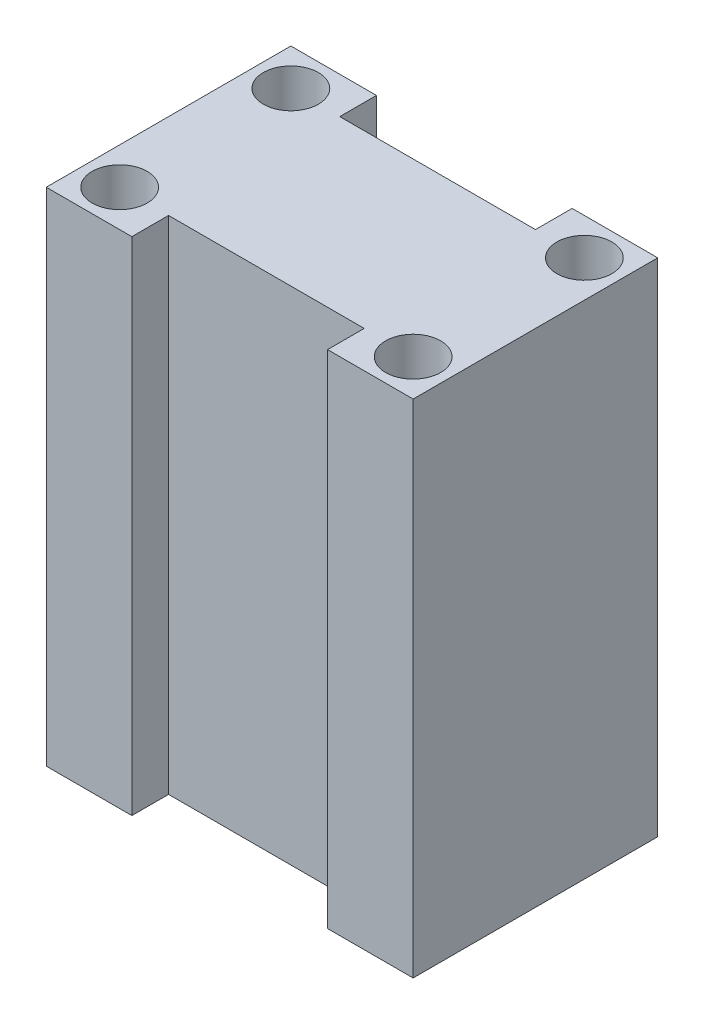
ISO-10303-21;
HEADER;
FILE_DESCRIPTION(('STEP AP214'),'2;1');
FILE_NAME('part.step','',(''),(''),'','','');
FILE_SCHEMA(('AUTOMOTIVE_DESIGN { 1 0 10303 214 1 1 1 1 }'));
ENDSEC;
DATA;
#1=APPLICATION_CONTEXT('core data for automotive mechanical design processes');
#2=APPLICATION_PROTOCOL_DEFINITION('international standard','automotive_design',2000,#1);
#3=PRODUCT_CONTEXT('',#1,'mechanical');
#4=PRODUCT('Part','Part','',(#3));
#5=PRODUCT_RELATED_PRODUCT_CATEGORY('part','',(#4));
#6=PRODUCT_DEFINITION_FORMATION('','',#4);
#7=PRODUCT_DEFINITION_CONTEXT('part definition',#1,'design');
#8=PRODUCT_DEFINITION('design','',#6,#7);
#9=PRODUCT_DEFINITION_SHAPE('','',#8);
#10=(LENGTH_UNIT() NAMED_UNIT(*) SI_UNIT(.MILLI.,.METRE.));
#11=(NAMED_UNIT(*) PLANE_ANGLE_UNIT() SI_UNIT($,.RADIAN.));
#12=(NAMED_UNIT(*) SI_UNIT($,.STERADIAN.) SOLID_ANGLE_UNIT());
#13=UNCERTAINTY_MEASURE_WITH_UNIT(LENGTH_MEASURE(1.E-05),#10,'distance_accuracy_value','');
#14=(GEOMETRIC_REPRESENTATION_CONTEXT(3) GLOBAL_UNCERTAINTY_ASSIGNED_CONTEXT((#13)) GLOBAL_UNIT_ASSIGNED_CONTEXT((#10,
#11,#12)) REPRESENTATION_CONTEXT('',''));
#15=CARTESIAN_POINT('',(0.,0.,0.));
#16=DIRECTION('',(0.,0.,1.));
#17=DIRECTION('',(1.,0.,0.));
#18=AXIS2_PLACEMENT_3D('',#15,#16,#17);
#19=CARTESIAN_POINT('',(0.,41.,-20.));
#20=DIRECTION('',(0.,0.,1.));
#21=DIRECTION('',(1.,0.,0.));
#22=AXIS2_PLACEMENT_3D('',#19,#20,#21);
#23=PLANE('',#22);
#24=DIRECTION('',(-1.,0.,0.));
#25=VECTOR('',#24,1.);
#26=CARTESIAN_POINT('',(0.,41.,-20.));
#27=LINE('',#26,#25);
#28=CARTESIAN_POINT('',(-23.,41.,-20.));
#29=VERTEX_POINT('',#28);
#30=CARTESIAN_POINT('',(-30.,41.,-20.));
#31=VERTEX_POINT('',#30);
#32=EDGE_CURVE('E222',#29,#31,#27,.T.);
#33=ORIENTED_EDGE('',*,*,#32,.F.);
#34=DIRECTION('',(0.,-1.,0.));
#35=VECTOR('',#34,1.);
#36=CARTESIAN_POINT('',(-23.,41.001,-20.));
#37=LINE('',#36,#35);
#38=CARTESIAN_POINT('',(-23.,0.,-20.));
#39=VERTEX_POINT('',#38);
#40=EDGE_CURVE('E214',#29,#39,#37,.T.);
#41=ORIENTED_EDGE('',*,*,#40,.T.);
#42=DIRECTION('',(-1.,0.,0.));
#43=VECTOR('',#42,1.);
#44=CARTESIAN_POINT('',(0.,0.,-20.));
#45=LINE('',#44,#43);
#46=CARTESIAN_POINT('',(-30.,0.,-20.));
#47=VERTEX_POINT('',#46);
#48=EDGE_CURVE('E161',#39,#47,#45,.T.);
#49=ORIENTED_EDGE('',*,*,#48,.T.);
#50=DIRECTION('',(0.,-1.,0.));
#51=VECTOR('',#50,1.);
#52=CARTESIAN_POINT('',(-30.,41.,-20.));
#53=LINE('',#52,#51);
#54=EDGE_CURVE('E43',#31,#47,#53,.T.);
#55=ORIENTED_EDGE('',*,*,#54,.F.);
#56=EDGE_LOOP('',(#33,#41,#49,#55));
#57=FACE_BOUND('',#56,.T.);
#58=ADVANCED_FACE('F35',(#57),#23,.F.);
#59=CARTESIAN_POINT('',(0.,41.,0.));
#60=DIRECTION('',(0.,0.,-1.));
#61=DIRECTION('',(-1.,0.,0.));
#62=AXIS2_PLACEMENT_3D('',#59,#60,#61);
#63=PLANE('',#62);
#64=DIRECTION('',(1.,0.,0.));
#65=VECTOR('',#64,1.);
#66=CARTESIAN_POINT('',(0.,0.,0.));
#67=LINE('',#66,#65);
#68=CARTESIAN_POINT('',(-30.,0.,0.));
#69=VERTEX_POINT('',#68);
#70=CARTESIAN_POINT('',(-23.,0.,0.));
#71=VERTEX_POINT('',#70);
#72=EDGE_CURVE('E141',#69,#71,#67,.T.);
#73=ORIENTED_EDGE('',*,*,#72,.T.);
#74=DIRECTION('',(0.,-1.,0.));
#75=VECTOR('',#74,1.);
#76=CARTESIAN_POINT('',(-23.,41.001,0.));
#77=LINE('',#76,#75);
#78=CARTESIAN_POINT('',(-23.,41.,0.));
#79=VERTEX_POINT('',#78);
#80=EDGE_CURVE('E127',#79,#71,#77,.T.);
#81=ORIENTED_EDGE('',*,*,#80,.F.);
#82=DIRECTION('',(1.,0.,0.));
#83=VECTOR('',#82,1.);
#84=CARTESIAN_POINT('',(0.,41.,0.));
#85=LINE('',#84,#83);
#86=CARTESIAN_POINT('',(-30.,41.,0.));
#87=VERTEX_POINT('',#86);
#88=EDGE_CURVE('E139',#87,#79,#85,.T.);
#89=ORIENTED_EDGE('',*,*,#88,.F.);
#90=DIRECTION('',(0.,-1.,0.));
#91=VECTOR('',#90,1.);
#92=CARTESIAN_POINT('',(-30.,41.,0.));
#93=LINE('',#92,#91);
#94=EDGE_CURVE('E154',#87,#69,#93,.T.);
#95=ORIENTED_EDGE('',*,*,#94,.T.);
#96=EDGE_LOOP('',(#73,#81,#89,#95));
#97=FACE_BOUND('',#96,.T.);
#98=ADVANCED_FACE('F137',(#97),#63,.F.);
#99=CARTESIAN_POINT('',(0.,41.,0.));
#100=DIRECTION('',(-1.,0.,0.));
#101=DIRECTION('',(0.,0.,1.));
#102=AXIS2_PLACEMENT_3D('',#99,#100,#101);
#103=PLANE('',#102);
#104=DIRECTION('',(0.,0.,-1.));
#105=VECTOR('',#104,1.);
#106=CARTESIAN_POINT('',(0.,0.,0.));
#107=LINE('',#106,#105);
#108=CARTESIAN_POINT('',(0.,0.,0.));
#109=VERTEX_POINT('',#108);
#110=CARTESIAN_POINT('',(0.,0.,-20.));
#111=VERTEX_POINT('',#110);
#112=EDGE_CURVE('E159',#109,#111,#107,.T.);
#113=ORIENTED_EDGE('',*,*,#112,.T.);
#114=DIRECTION('',(0.,-1.,0.));
#115=VECTOR('',#114,1.);
#116=CARTESIAN_POINT('',(0.,41.,-20.));
#117=LINE('',#116,#115);
#118=CARTESIAN_POINT('',(0.,41.,-20.));
#119=VERTEX_POINT('',#118);
#120=EDGE_CURVE('E11',#119,#111,#117,.T.);
#121=ORIENTED_EDGE('',*,*,#120,.F.);
#122=DIRECTION('',(0.,0.,-1.));
#123=VECTOR('',#122,1.);
#124=CARTESIAN_POINT('',(0.,41.,0.));
#125=LINE('',#124,#123);
#126=CARTESIAN_POINT('',(0.,41.,0.));
#127=VERTEX_POINT('',#126);
#128=EDGE_CURVE('E168',#127,#119,#125,.T.);
#129=ORIENTED_EDGE('',*,*,#128,.F.);
#130=DIRECTION('',(0.,-1.,0.));
#131=VECTOR('',#130,1.);
#132=CARTESIAN_POINT('',(0.,41.,0.));
#133=LINE('',#132,#131);
#134=EDGE_CURVE('E150',#127,#109,#133,.T.);
#135=ORIENTED_EDGE('',*,*,#134,.T.);
#136=EDGE_LOOP('',(#113,#121,#129,#135));
#137=FACE_BOUND('',#136,.T.);
#138=ADVANCED_FACE('F37',(#137),#103,.F.);
#139=CARTESIAN_POINT('',(-7.,0.,-20.));
#140=VERTEX_POINT('',#139);
#141=EDGE_CURVE('E162',#111,#140,#45,.T.);
#142=ORIENTED_EDGE('',*,*,#141,.T.);
#143=DIRECTION('',(0.,-1.,0.));
#144=VECTOR('',#143,1.);
#145=CARTESIAN_POINT('',(-7.,41.001,-20.));
#146=LINE('',#145,#144);
#147=CARTESIAN_POINT('',(-7.,41.,-20.));
#148=VERTEX_POINT('',#147);
#149=EDGE_CURVE('E58',#148,#140,#146,.T.);
#150=ORIENTED_EDGE('',*,*,#149,.F.);
#151=EDGE_CURVE('E223',#119,#148,#27,.T.);
#152=ORIENTED_EDGE('',*,*,#151,.F.);
#153=ORIENTED_EDGE('',*,*,#120,.T.);
#154=EDGE_LOOP('',(#142,#150,#152,#153));
#155=FACE_BOUND('',#154,.T.);
#156=ADVANCED_FACE('F248',(#155),#23,.F.);
#157=CARTESIAN_POINT('',(-30.,41.,0.));
#158=DIRECTION('',(1.,0.,0.));
#159=DIRECTION('',(0.,0.,-1.));
#160=AXIS2_PLACEMENT_3D('',#157,#158,#159);
#161=PLANE('',#160);
#162=DIRECTION('',(0.,0.,1.));
#163=VECTOR('',#162,1.);
#164=CARTESIAN_POINT('',(-30.,0.,0.));
#165=LINE('',#164,#163);
#166=EDGE_CURVE('E165',#47,#69,#165,.T.);
#167=ORIENTED_EDGE('',*,*,#166,.T.);
#168=ORIENTED_EDGE('',*,*,#94,.F.);
#169=DIRECTION('',(0.,0.,1.));
#170=VECTOR('',#169,1.);
#171=CARTESIAN_POINT('',(-30.,41.,0.));
#172=LINE('',#171,#170);
#173=EDGE_CURVE('E148',#31,#87,#172,.T.);
#174=ORIENTED_EDGE('',*,*,#173,.F.);
#175=ORIENTED_EDGE('',*,*,#54,.T.);
#176=EDGE_LOOP('',(#167,#168,#174,#175));
#177=FACE_BOUND('',#176,.T.);
#178=ADVANCED_FACE('F174',(#177),#161,.F.);
#179=CARTESIAN_POINT('',(-7.,41.,0.));
#180=VERTEX_POINT('',#179);
#181=EDGE_CURVE('E151',#180,#127,#85,.T.);
#182=ORIENTED_EDGE('',*,*,#181,.F.);
#183=DIRECTION('',(0.,-1.,0.));
#184=VECTOR('',#183,1.);
#185=CARTESIAN_POINT('',(-7.,41.001,0.));
#186=LINE('',#185,#184);
#187=CARTESIAN_POINT('',(-7.,0.,0.));
#188=VERTEX_POINT('',#187);
#189=EDGE_CURVE('E143',#180,#188,#186,.T.);
#190=ORIENTED_EDGE('',*,*,#189,.T.);
#191=EDGE_CURVE('E167',#188,#109,#67,.T.);
#192=ORIENTED_EDGE('',*,*,#191,.T.);
#193=ORIENTED_EDGE('',*,*,#134,.F.);
#194=EDGE_LOOP('',(#182,#190,#192,#193));
#195=FACE_BOUND('',#194,.T.);
#196=ADVANCED_FACE('F253',(#195),#63,.F.);
#197=CARTESIAN_POINT('',(0.,41.,0.));
#198=DIRECTION('',(0.,1.,0.));
#199=DIRECTION('',(0.,0.,1.));
#200=AXIS2_PLACEMENT_3D('',#197,#198,#199);
#201=PLANE('',#200);
#202=ORIENTED_EDGE('',*,*,#173,.T.);
#203=ORIENTED_EDGE('',*,*,#88,.T.);
#204=DIRECTION('',(0.,0.,-1.));
#205=VECTOR('',#204,1.);
#206=CARTESIAN_POINT('',(-23.,41.,0.));
#207=LINE('',#206,#205);
#208=CARTESIAN_POINT('',(-23.,41.,-3.));
#209=VERTEX_POINT('',#208);
#210=EDGE_CURVE('E124',#79,#209,#207,.T.);
#211=ORIENTED_EDGE('',*,*,#210,.T.);
#212=DIRECTION('',(1.,0.,0.));
#213=VECTOR('',#212,1.);
#214=CARTESIAN_POINT('',(-23.,41.,-3.));
#215=LINE('',#214,#213);
#216=CARTESIAN_POINT('',(-7.,41.,-3.));
#217=VERTEX_POINT('',#216);
#218=EDGE_CURVE('E142',#209,#217,#215,.T.);
#219=ORIENTED_EDGE('',*,*,#218,.T.);
#220=DIRECTION('',(0.,0.,1.));
#221=VECTOR('',#220,1.);
#222=CARTESIAN_POINT('',(-7.,41.,0.));
#223=LINE('',#222,#221);
#224=EDGE_CURVE('E132',#217,#180,#223,.T.);
#225=ORIENTED_EDGE('',*,*,#224,.T.);
#226=ORIENTED_EDGE('',*,*,#181,.T.);
#227=ORIENTED_EDGE('',*,*,#128,.T.);
#228=ORIENTED_EDGE('',*,*,#151,.T.);
#229=DIRECTION('',(0.,0.,1.));
#230=VECTOR('',#229,1.);
#231=CARTESIAN_POINT('',(-7.,41.,-20.));
#232=LINE('',#231,#230);
#233=CARTESIAN_POINT('',(-7.,41.,-17.));
#234=VERTEX_POINT('',#233);
#235=EDGE_CURVE('E197',#148,#234,#232,.T.);
#236=ORIENTED_EDGE('',*,*,#235,.T.);
#237=DIRECTION('',(-1.,0.,0.));
#238=VECTOR('',#237,1.);
#239=CARTESIAN_POINT('',(-23.,41.,-17.));
#240=LINE('',#239,#238);
#241=CARTESIAN_POINT('',(-23.,41.,-17.));
#242=VERTEX_POINT('',#241);
#243=EDGE_CURVE('E200',#234,#242,#240,.T.);
#244=ORIENTED_EDGE('',*,*,#243,.T.);
#245=DIRECTION('',(0.,0.,-1.));
#246=VECTOR('',#245,1.);
#247=CARTESIAN_POINT('',(-23.,41.,-20.));
#248=LINE('',#247,#246);
#249=EDGE_CURVE('E204',#242,#29,#248,.T.);
#250=ORIENTED_EDGE('',*,*,#249,.T.);
#251=ORIENTED_EDGE('',*,*,#32,.T.);
#252=EDGE_LOOP('',(#202,#203,#211,#219,#225,#226,#227,#228,#236,#244,#250,#251));
#253=FACE_BOUND('',#252,.T.);
#254=CARTESIAN_POINT('',(-3.,41.,-17.));
#255=DIRECTION('',(0.,1.,0.));
#256=DIRECTION('',(0.,0.,1.));
#257=AXIS2_PLACEMENT_3D('',#254,#255,#256);
#258=CIRCLE('',#257,2.25);
#259=CARTESIAN_POINT('',(-3.,41.,-14.75));
#260=VERTEX_POINT('',#259);
#261=EDGE_CURVE('E280',#260,#260,#258,.T.);
#262=ORIENTED_EDGE('',*,*,#261,.F.);
#263=EDGE_LOOP('',(#262));
#264=FACE_BOUND('',#263,.T.);
#265=CARTESIAN_POINT('',(-3.,41.,-3.));
#266=DIRECTION('',(0.,1.,0.));
#267=DIRECTION('',(0.,0.,1.));
#268=AXIS2_PLACEMENT_3D('',#265,#266,#267);
#269=CIRCLE('',#268,2.25);
#270=CARTESIAN_POINT('',(-3.,41.,-0.750000000000001));
#271=VERTEX_POINT('',#270);
#272=EDGE_CURVE('E287',#271,#271,#269,.T.);
#273=ORIENTED_EDGE('',*,*,#272,.F.);
#274=EDGE_LOOP('',(#273));
#275=FACE_BOUND('',#274,.T.);
#276=CARTESIAN_POINT('',(-27.,41.,-3.));
#277=DIRECTION('',(0.,1.,0.));
#278=DIRECTION('',(0.,0.,1.));
#279=AXIS2_PLACEMENT_3D('',#276,#277,#278);
#280=CIRCLE('',#279,2.25);
#281=CARTESIAN_POINT('',(-27.,41.,-0.750000000000001));
#282=VERTEX_POINT('',#281);
#283=EDGE_CURVE('E293',#282,#282,#280,.T.);
#284=ORIENTED_EDGE('',*,*,#283,.F.);
#285=EDGE_LOOP('',(#284));
#286=FACE_BOUND('',#285,.T.);
#287=CARTESIAN_POINT('',(-27.,41.,-17.));
#288=DIRECTION('',(0.,1.,0.));
#289=DIRECTION('',(0.,0.,1.));
#290=AXIS2_PLACEMENT_3D('',#287,#288,#289);
#291=CIRCLE('',#290,2.25);
#292=CARTESIAN_POINT('',(-27.,41.,-14.75));
#293=VERTEX_POINT('',#292);
#294=EDGE_CURVE('E274',#293,#293,#291,.T.);
#295=ORIENTED_EDGE('',*,*,#294,.F.);
#296=EDGE_LOOP('',(#295));
#297=FACE_BOUND('',#296,.T.);
#298=ADVANCED_FACE('F145',(#253,#264,#275,#286,#297),#201,.T.);
#299=CARTESIAN_POINT('',(0.,0.,0.));
#300=DIRECTION('',(0.,1.,0.));
#301=DIRECTION('',(0.,0.,1.));
#302=AXIS2_PLACEMENT_3D('',#299,#300,#301);
#303=PLANE('',#302);
#304=CARTESIAN_POINT('',(-3.,0.,-3.));
#305=DIRECTION('',(0.,-1.,0.));
#306=DIRECTION('',(0.,0.,-1.));
#307=AXIS2_PLACEMENT_3D('',#304,#305,#306);
#308=CIRCLE('',#307,2.25);
#309=CARTESIAN_POINT('',(-3.,0.,-5.25));
#310=VERTEX_POINT('',#309);
#311=EDGE_CURVE('E304',#310,#310,#308,.T.);
#312=ORIENTED_EDGE('',*,*,#311,.F.);
#313=EDGE_LOOP('',(#312));
#314=FACE_BOUND('',#313,.T.);
#315=CARTESIAN_POINT('',(-27.,0.,-3.));
#316=DIRECTION('',(0.,-1.,0.));
#317=DIRECTION('',(0.,0.,-1.));
#318=AXIS2_PLACEMENT_3D('',#315,#316,#317);
#319=CIRCLE('',#318,2.25);
#320=CARTESIAN_POINT('',(-27.,0.,-5.25));
#321=VERTEX_POINT('',#320);
#322=EDGE_CURVE('E310',#321,#321,#319,.T.);
#323=ORIENTED_EDGE('',*,*,#322,.F.);
#324=EDGE_LOOP('',(#323));
#325=FACE_BOUND('',#324,.T.);
#326=CARTESIAN_POINT('',(-27.,0.,-17.));
#327=DIRECTION('',(0.,-1.,0.));
#328=DIRECTION('',(0.,0.,-1.));
#329=AXIS2_PLACEMENT_3D('',#326,#327,#328);
#330=CIRCLE('',#329,2.25);
#331=CARTESIAN_POINT('',(-27.,0.,-19.25));
#332=VERTEX_POINT('',#331);
#333=EDGE_CURVE('E316',#332,#332,#330,.T.);
#334=ORIENTED_EDGE('',*,*,#333,.F.);
#335=EDGE_LOOP('',(#334));
#336=FACE_BOUND('',#335,.T.);
#337=CARTESIAN_POINT('',(-3.,0.,-17.));
#338=DIRECTION('',(0.,-1.,0.));
#339=DIRECTION('',(0.,0.,-1.));
#340=AXIS2_PLACEMENT_3D('',#337,#338,#339);
#341=CIRCLE('',#340,2.25);
#342=CARTESIAN_POINT('',(-3.,0.,-19.25));
#343=VERTEX_POINT('',#342);
#344=EDGE_CURVE('E298',#343,#343,#341,.T.);
#345=ORIENTED_EDGE('',*,*,#344,.F.);
#346=EDGE_LOOP('',(#345));
#347=FACE_BOUND('',#346,.T.);
#348=ORIENTED_EDGE('',*,*,#72,.F.);
#349=ORIENTED_EDGE('',*,*,#166,.F.);
#350=ORIENTED_EDGE('',*,*,#48,.F.);
#351=DIRECTION('',(0.,0.,-1.));
#352=VECTOR('',#351,1.);
#353=CARTESIAN_POINT('',(-23.,0.,-20.));
#354=LINE('',#353,#352);
#355=CARTESIAN_POINT('',(-23.,0.,-17.));
#356=VERTEX_POINT('',#355);
#357=EDGE_CURVE('E207',#356,#39,#354,.T.);
#358=ORIENTED_EDGE('',*,*,#357,.F.);
#359=DIRECTION('',(-1.,0.,0.));
#360=VECTOR('',#359,1.);
#361=CARTESIAN_POINT('',(-23.,0.,-17.));
#362=LINE('',#361,#360);
#363=CARTESIAN_POINT('',(-7.,0.,-17.));
#364=VERTEX_POINT('',#363);
#365=EDGE_CURVE('E211',#364,#356,#362,.T.);
#366=ORIENTED_EDGE('',*,*,#365,.F.);
#367=DIRECTION('',(0.,0.,1.));
#368=VECTOR('',#367,1.);
#369=CARTESIAN_POINT('',(-7.,0.,-20.));
#370=LINE('',#369,#368);
#371=EDGE_CURVE('E209',#140,#364,#370,.T.);
#372=ORIENTED_EDGE('',*,*,#371,.F.);
#373=ORIENTED_EDGE('',*,*,#141,.F.);
#374=ORIENTED_EDGE('',*,*,#112,.F.);
#375=ORIENTED_EDGE('',*,*,#191,.F.);
#376=DIRECTION('',(0.,0.,1.));
#377=VECTOR('',#376,1.);
#378=CARTESIAN_POINT('',(-7.,0.,0.));
#379=LINE('',#378,#377);
#380=CARTESIAN_POINT('',(-7.,0.,-3.));
#381=VERTEX_POINT('',#380);
#382=EDGE_CURVE('E186',#381,#188,#379,.T.);
#383=ORIENTED_EDGE('',*,*,#382,.F.);
#384=DIRECTION('',(1.,0.,0.));
#385=VECTOR('',#384,1.);
#386=CARTESIAN_POINT('',(-23.,0.,-3.));
#387=LINE('',#386,#385);
#388=CARTESIAN_POINT('',(-23.,0.,-3.));
#389=VERTEX_POINT('',#388);
#390=EDGE_CURVE('E184',#389,#381,#387,.T.);
#391=ORIENTED_EDGE('',*,*,#390,.F.);
#392=DIRECTION('',(0.,0.,-1.));
#393=VECTOR('',#392,1.);
#394=CARTESIAN_POINT('',(-23.,0.,0.));
#395=LINE('',#394,#393);
#396=EDGE_CURVE('E50',#71,#389,#395,.T.);
#397=ORIENTED_EDGE('',*,*,#396,.F.);
#398=EDGE_LOOP('',(#348,#349,#350,#358,#366,#372,#373,#374,#375,#383,#391,#397));
#399=FACE_BOUND('',#398,.T.);
#400=ADVANCED_FACE('F179',(#314,#325,#336,#347,#399),#303,.F.);
#401=CARTESIAN_POINT('',(-23.,41.001,0.));
#402=DIRECTION('',(-1.,0.,0.));
#403=DIRECTION('',(0.,0.,1.));
#404=AXIS2_PLACEMENT_3D('',#401,#402,#403);
#405=PLANE('',#404);
#406=ORIENTED_EDGE('',*,*,#80,.T.);
#407=ORIENTED_EDGE('',*,*,#396,.T.);
#408=DIRECTION('',(0.,-1.,0.));
#409=VECTOR('',#408,1.);
#410=CARTESIAN_POINT('',(-23.,41.001,-3.));
#411=LINE('',#410,#409);
#412=EDGE_CURVE('E128',#209,#389,#411,.T.);
#413=ORIENTED_EDGE('',*,*,#412,.F.);
#414=ORIENTED_EDGE('',*,*,#210,.F.);
#415=EDGE_LOOP('',(#406,#407,#413,#414));
#416=FACE_BOUND('',#415,.T.);
#417=ADVANCED_FACE('F126',(#416),#405,.F.);
#418=CARTESIAN_POINT('',(-7.,41.001,0.));
#419=DIRECTION('',(1.,0.,0.));
#420=DIRECTION('',(0.,0.,-1.));
#421=AXIS2_PLACEMENT_3D('',#418,#419,#420);
#422=PLANE('',#421);
#423=DIRECTION('',(0.,-1.,0.));
#424=VECTOR('',#423,1.);
#425=CARTESIAN_POINT('',(-7.,41.001,-3.));
#426=LINE('',#425,#424);
#427=EDGE_CURVE('E193',#217,#381,#426,.T.);
#428=ORIENTED_EDGE('',*,*,#427,.T.);
#429=ORIENTED_EDGE('',*,*,#382,.T.);
#430=ORIENTED_EDGE('',*,*,#189,.F.);
#431=ORIENTED_EDGE('',*,*,#224,.F.);
#432=EDGE_LOOP('',(#428,#429,#430,#431));
#433=FACE_BOUND('',#432,.T.);
#434=ADVANCED_FACE('F271',(#433),#422,.F.);
#435=CARTESIAN_POINT('',(-23.,41.001,-3.));
#436=DIRECTION('',(0.,0.,-1.));
#437=DIRECTION('',(-1.,0.,0.));
#438=AXIS2_PLACEMENT_3D('',#435,#436,#437);
#439=PLANE('',#438);
#440=ORIENTED_EDGE('',*,*,#412,.T.);
#441=ORIENTED_EDGE('',*,*,#390,.T.);
#442=ORIENTED_EDGE('',*,*,#427,.F.);
#443=ORIENTED_EDGE('',*,*,#218,.F.);
#444=EDGE_LOOP('',(#440,#441,#442,#443));
#445=FACE_BOUND('',#444,.T.);
#446=ADVANCED_FACE('F378',(#445),#439,.F.);
#447=CARTESIAN_POINT('',(-23.,41.001,-20.));
#448=DIRECTION('',(-1.,0.,0.));
#449=DIRECTION('',(0.,0.,1.));
#450=AXIS2_PLACEMENT_3D('',#447,#448,#449);
#451=PLANE('',#450);
#452=DIRECTION('',(0.,-1.,0.));
#453=VECTOR('',#452,1.);
#454=CARTESIAN_POINT('',(-23.,41.001,-17.));
#455=LINE('',#454,#453);
#456=EDGE_CURVE('E215',#242,#356,#455,.T.);
#457=ORIENTED_EDGE('',*,*,#456,.T.);
#458=ORIENTED_EDGE('',*,*,#357,.T.);
#459=ORIENTED_EDGE('',*,*,#40,.F.);
#460=ORIENTED_EDGE('',*,*,#249,.F.);
#461=EDGE_LOOP('',(#457,#458,#459,#460));
#462=FACE_BOUND('',#461,.T.);
#463=ADVANCED_FACE('F227',(#462),#451,.F.);
#464=CARTESIAN_POINT('',(-23.,41.001,-17.));
#465=DIRECTION('',(0.,0.,1.));
#466=DIRECTION('',(1.,0.,0.));
#467=AXIS2_PLACEMENT_3D('',#464,#465,#466);
#468=PLANE('',#467);
#469=DIRECTION('',(0.,-1.,0.));
#470=VECTOR('',#469,1.);
#471=CARTESIAN_POINT('',(-7.,41.001,-17.));
#472=LINE('',#471,#470);
#473=EDGE_CURVE('E217',#234,#364,#472,.T.);
#474=ORIENTED_EDGE('',*,*,#473,.T.);
#475=ORIENTED_EDGE('',*,*,#365,.T.);
#476=ORIENTED_EDGE('',*,*,#456,.F.);
#477=ORIENTED_EDGE('',*,*,#243,.F.);
#478=EDGE_LOOP('',(#474,#475,#476,#477));
#479=FACE_BOUND('',#478,.T.);
#480=ADVANCED_FACE('F232',(#479),#468,.F.);
#481=CARTESIAN_POINT('',(-7.,41.001,-20.));
#482=DIRECTION('',(1.,0.,0.));
#483=DIRECTION('',(0.,0.,-1.));
#484=AXIS2_PLACEMENT_3D('',#481,#482,#483);
#485=PLANE('',#484);
#486=ORIENTED_EDGE('',*,*,#149,.T.);
#487=ORIENTED_EDGE('',*,*,#371,.T.);
#488=ORIENTED_EDGE('',*,*,#473,.F.);
#489=ORIENTED_EDGE('',*,*,#235,.F.);
#490=EDGE_LOOP('',(#486,#487,#488,#489));
#491=FACE_BOUND('',#490,.T.);
#492=ADVANCED_FACE('F234',(#491),#485,.F.);
#493=CARTESIAN_POINT('',(-27.,36.,-17.));
#494=DIRECTION('',(0.,1.,0.));
#495=DIRECTION('',(0.,0.,1.));
#496=AXIS2_PLACEMENT_3D('',#493,#494,#495);
#497=CYLINDRICAL_SURFACE('',#496,2.25);
#498=CARTESIAN_POINT('',(-27.,36.,-17.));
#499=DIRECTION('',(0.,1.,0.));
#500=DIRECTION('',(0.,0.,1.));
#501=AXIS2_PLACEMENT_3D('',#498,#499,#500);
#502=CIRCLE('',#501,2.25);
#503=CARTESIAN_POINT('',(-27.,36.,-14.75));
#504=VERTEX_POINT('',#503);
#505=EDGE_CURVE('E201',#504,#504,#502,.T.);
#506=ORIENTED_EDGE('',*,*,#505,.F.);
#507=EDGE_LOOP('',(#506));
#508=FACE_BOUND('',#507,.T.);
#509=ORIENTED_EDGE('',*,*,#294,.T.);
#510=EDGE_LOOP('',(#509));
#511=FACE_BOUND('',#510,.T.);
#512=ADVANCED_FACE('F236',(#508,#511),#497,.F.);
#513=CARTESIAN_POINT('',(-27.,36.,-17.));
#514=DIRECTION('',(0.,1.,0.));
#515=DIRECTION('',(0.,0.,1.));
#516=AXIS2_PLACEMENT_3D('',#513,#514,#515);
#517=PLANE('',#516);
#518=ORIENTED_EDGE('',*,*,#505,.T.);
#519=EDGE_LOOP('',(#518));
#520=FACE_BOUND('',#519,.T.);
#521=ADVANCED_FACE('F242',(#520),#517,.T.);
#522=CARTESIAN_POINT('',(-27.,36.,-3.));
#523=DIRECTION('',(0.,1.,0.));
#524=DIRECTION('',(0.,0.,1.));
#525=AXIS2_PLACEMENT_3D('',#522,#523,#524);
#526=CYLINDRICAL_SURFACE('',#525,2.25);
#527=CARTESIAN_POINT('',(-27.,36.,-3.));
#528=DIRECTION('',(0.,1.,0.));
#529=DIRECTION('',(0.,0.,1.));
#530=AXIS2_PLACEMENT_3D('',#527,#528,#529);
#531=CIRCLE('',#530,2.25);
#532=CARTESIAN_POINT('',(-27.,36.,-0.750000000000001));
#533=VERTEX_POINT('',#532);
#534=EDGE_CURVE('E277',#533,#533,#531,.T.);
#535=ORIENTED_EDGE('',*,*,#534,.F.);
#536=EDGE_LOOP('',(#535));
#537=FACE_BOUND('',#536,.T.);
#538=ORIENTED_EDGE('',*,*,#283,.T.);
#539=EDGE_LOOP('',(#538));
#540=FACE_BOUND('',#539,.T.);
#541=ADVANCED_FACE('F358',(#537,#540),#526,.F.);
#542=CARTESIAN_POINT('',(-27.,36.,-3.));
#543=DIRECTION('',(0.,1.,0.));
#544=DIRECTION('',(0.,0.,1.));
#545=AXIS2_PLACEMENT_3D('',#542,#543,#544);
#546=PLANE('',#545);
#547=ORIENTED_EDGE('',*,*,#534,.T.);
#548=EDGE_LOOP('',(#547));
#549=FACE_BOUND('',#548,.T.);
#550=ADVANCED_FACE('F354',(#549),#546,.T.);
#551=CARTESIAN_POINT('',(-3.,36.,-3.));
#552=DIRECTION('',(0.,1.,0.));
#553=DIRECTION('',(0.,0.,1.));
#554=AXIS2_PLACEMENT_3D('',#551,#552,#553);
#555=CYLINDRICAL_SURFACE('',#554,2.25);
#556=CARTESIAN_POINT('',(-3.,36.,-3.));
#557=DIRECTION('',(0.,1.,0.));
#558=DIRECTION('',(0.,0.,1.));
#559=AXIS2_PLACEMENT_3D('',#556,#557,#558);
#560=CIRCLE('',#559,2.25);
#561=CARTESIAN_POINT('',(-3.,36.,-0.750000000000001));
#562=VERTEX_POINT('',#561);
#563=EDGE_CURVE('E290',#562,#562,#560,.T.);
#564=ORIENTED_EDGE('',*,*,#563,.F.);
#565=EDGE_LOOP('',(#564));
#566=FACE_BOUND('',#565,.T.);
#567=ORIENTED_EDGE('',*,*,#272,.T.);
#568=EDGE_LOOP('',(#567));
#569=FACE_BOUND('',#568,.T.);
#570=ADVANCED_FACE('F357',(#566,#569),#555,.F.);
#571=CARTESIAN_POINT('',(-3.,36.,-3.));
#572=DIRECTION('',(0.,1.,0.));
#573=DIRECTION('',(0.,0.,1.));
#574=AXIS2_PLACEMENT_3D('',#571,#572,#573);
#575=PLANE('',#574);
#576=ORIENTED_EDGE('',*,*,#563,.T.);
#577=EDGE_LOOP('',(#576));
#578=FACE_BOUND('',#577,.T.);
#579=ADVANCED_FACE('F363',(#578),#575,.T.);
#580=CARTESIAN_POINT('',(-3.,36.,-17.));
#581=DIRECTION('',(0.,1.,0.));
#582=DIRECTION('',(0.,0.,1.));
#583=AXIS2_PLACEMENT_3D('',#580,#581,#582);
#584=CYLINDRICAL_SURFACE('',#583,2.25);
#585=CARTESIAN_POINT('',(-3.,36.,-17.));
#586=DIRECTION('',(0.,1.,0.));
#587=DIRECTION('',(0.,0.,1.));
#588=AXIS2_PLACEMENT_3D('',#585,#586,#587);
#589=CIRCLE('',#588,2.25);
#590=CARTESIAN_POINT('',(-3.,36.,-14.75));
#591=VERTEX_POINT('',#590);
#592=EDGE_CURVE('E283',#591,#591,#589,.T.);
#593=ORIENTED_EDGE('',*,*,#592,.F.);
#594=EDGE_LOOP('',(#593));
#595=FACE_BOUND('',#594,.T.);
#596=ORIENTED_EDGE('',*,*,#261,.T.);
#597=EDGE_LOOP('',(#596));
#598=FACE_BOUND('',#597,.T.);
#599=ADVANCED_FACE('F348',(#595,#598),#584,.F.);
#600=CARTESIAN_POINT('',(-3.,36.,-17.));
#601=DIRECTION('',(0.,1.,0.));
#602=DIRECTION('',(0.,0.,1.));
#603=AXIS2_PLACEMENT_3D('',#600,#601,#602);
#604=PLANE('',#603);
#605=ORIENTED_EDGE('',*,*,#592,.T.);
#606=EDGE_LOOP('',(#605));
#607=FACE_BOUND('',#606,.T.);
#608=ADVANCED_FACE('F339',(#607),#604,.T.);
#609=CARTESIAN_POINT('',(-3.,5.,-17.));
#610=DIRECTION('',(0.,-1.,0.));
#611=DIRECTION('',(0.,0.,-1.));
#612=AXIS2_PLACEMENT_3D('',#609,#610,#611);
#613=CYLINDRICAL_SURFACE('',#612,2.25);
#614=CARTESIAN_POINT('',(-3.,5.,-17.));
#615=DIRECTION('',(0.,-1.,0.));
#616=DIRECTION('',(0.,0.,-1.));
#617=AXIS2_PLACEMENT_3D('',#614,#615,#616);
#618=CIRCLE('',#617,2.25);
#619=CARTESIAN_POINT('',(-3.,5.,-19.25));
#620=VERTEX_POINT('',#619);
#621=EDGE_CURVE('E284',#620,#620,#618,.T.);
#622=ORIENTED_EDGE('',*,*,#621,.F.);
#623=EDGE_LOOP('',(#622));
#624=FACE_BOUND('',#623,.T.);
#625=ORIENTED_EDGE('',*,*,#344,.T.);
#626=EDGE_LOOP('',(#625));
#627=FACE_BOUND('',#626,.T.);
#628=ADVANCED_FACE('F337',(#624,#627),#613,.F.);
#629=CARTESIAN_POINT('',(-3.,5.,-17.));
#630=DIRECTION('',(0.,-1.,0.));
#631=DIRECTION('',(0.,0.,-1.));
#632=AXIS2_PLACEMENT_3D('',#629,#630,#631);
#633=PLANE('',#632);
#634=ORIENTED_EDGE('',*,*,#621,.T.);
#635=EDGE_LOOP('',(#634));
#636=FACE_BOUND('',#635,.T.);
#637=ADVANCED_FACE('F327',(#636),#633,.T.);
#638=CARTESIAN_POINT('',(-27.,5.,-17.));
#639=DIRECTION('',(0.,-1.,0.));
#640=DIRECTION('',(0.,0.,-1.));
#641=AXIS2_PLACEMENT_3D('',#638,#639,#640);
#642=CYLINDRICAL_SURFACE('',#641,2.25);
#643=CARTESIAN_POINT('',(-27.,5.,-17.));
#644=DIRECTION('',(0.,-1.,0.));
#645=DIRECTION('',(0.,0.,-1.));
#646=AXIS2_PLACEMENT_3D('',#643,#644,#645);
#647=CIRCLE('',#646,2.25);
#648=CARTESIAN_POINT('',(-27.,5.,-19.25));
#649=VERTEX_POINT('',#648);
#650=EDGE_CURVE('E301',#649,#649,#647,.T.);
#651=ORIENTED_EDGE('',*,*,#650,.F.);
#652=EDGE_LOOP('',(#651));
#653=FACE_BOUND('',#652,.T.);
#654=ORIENTED_EDGE('',*,*,#333,.T.);
#655=EDGE_LOOP('',(#654));
#656=FACE_BOUND('',#655,.T.);
#657=ADVANCED_FACE('F324',(#653,#656),#642,.F.);
#658=CARTESIAN_POINT('',(-27.,5.,-17.));
#659=DIRECTION('',(0.,-1.,0.));
#660=DIRECTION('',(0.,0.,-1.));
#661=AXIS2_PLACEMENT_3D('',#658,#659,#660);
#662=PLANE('',#661);
#663=ORIENTED_EDGE('',*,*,#650,.T.);
#664=EDGE_LOOP('',(#663));
#665=FACE_BOUND('',#664,.T.);
#666=ADVANCED_FACE('F322',(#665),#662,.T.);
#667=CARTESIAN_POINT('',(-27.,5.,-3.));
#668=DIRECTION('',(0.,-1.,0.));
#669=DIRECTION('',(0.,0.,-1.));
#670=AXIS2_PLACEMENT_3D('',#667,#668,#669);
#671=CYLINDRICAL_SURFACE('',#670,2.25);
#672=CARTESIAN_POINT('',(-27.,5.,-3.));
#673=DIRECTION('',(0.,-1.,0.));
#674=DIRECTION('',(0.,0.,-1.));
#675=AXIS2_PLACEMENT_3D('',#672,#673,#674);
#676=CIRCLE('',#675,2.25);
#677=CARTESIAN_POINT('',(-27.,5.,-5.25));
#678=VERTEX_POINT('',#677);
#679=EDGE_CURVE('E313',#678,#678,#676,.T.);
#680=ORIENTED_EDGE('',*,*,#679,.F.);
#681=EDGE_LOOP('',(#680));
#682=FACE_BOUND('',#681,.T.);
#683=ORIENTED_EDGE('',*,*,#322,.T.);
#684=EDGE_LOOP('',(#683));
#685=FACE_BOUND('',#684,.T.);
#686=ADVANCED_FACE('F511',(#682,#685),#671,.F.);
#687=CARTESIAN_POINT('',(-27.,5.,-3.));
#688=DIRECTION('',(0.,-1.,0.));
#689=DIRECTION('',(0.,0.,-1.));
#690=AXIS2_PLACEMENT_3D('',#687,#688,#689);
#691=PLANE('',#690);
#692=ORIENTED_EDGE('',*,*,#679,.T.);
#693=EDGE_LOOP('',(#692));
#694=FACE_BOUND('',#693,.T.);
#695=ADVANCED_FACE('F520',(#694),#691,.T.);
#696=CARTESIAN_POINT('',(-3.,5.,-3.));
#697=DIRECTION('',(0.,-1.,0.));
#698=DIRECTION('',(0.,0.,-1.));
#699=AXIS2_PLACEMENT_3D('',#696,#697,#698);
#700=CYLINDRICAL_SURFACE('',#699,2.25);
#701=CARTESIAN_POINT('',(-3.,5.,-3.));
#702=DIRECTION('',(0.,-1.,0.));
#703=DIRECTION('',(0.,0.,-1.));
#704=AXIS2_PLACEMENT_3D('',#701,#702,#703);
#705=CIRCLE('',#704,2.25);
#706=CARTESIAN_POINT('',(-3.,5.,-5.25));
#707=VERTEX_POINT('',#706);
#708=EDGE_CURVE('E307',#707,#707,#705,.T.);
#709=ORIENTED_EDGE('',*,*,#708,.F.);
#710=EDGE_LOOP('',(#709));
#711=FACE_BOUND('',#710,.T.);
#712=ORIENTED_EDGE('',*,*,#311,.T.);
#713=EDGE_LOOP('',(#712));
#714=FACE_BOUND('',#713,.T.);
#715=ADVANCED_FACE('F530',(#711,#714),#700,.F.);
#716=CARTESIAN_POINT('',(-3.,5.,-3.));
#717=DIRECTION('',(0.,-1.,0.));
#718=DIRECTION('',(0.,0.,-1.));
#719=AXIS2_PLACEMENT_3D('',#716,#717,#718);
#720=PLANE('',#719);
#721=ORIENTED_EDGE('',*,*,#708,.T.);
#722=EDGE_LOOP('',(#721));
#723=FACE_BOUND('',#722,.T.);
#724=ADVANCED_FACE('F540',(#723),#720,.T.);
#725=CLOSED_SHELL('',(#58,#98,#138,#156,#178,#196,#298,#400,#417,#434,#446,#463,#480,#492,#512,
#521,#541,#550,#570,#579,#599,#608,#628,#637,#657,#666,#686,#695,#715,#724));
#726=MANIFOLD_SOLID_BREP('B2',#725);
#727=ADVANCED_BREP_SHAPE_REPRESENTATION('',(#18,#726),#14);
#728=SHAPE_DEFINITION_REPRESENTATION(#9,#727);
ENDSEC;
END-ISO-10303-21;
